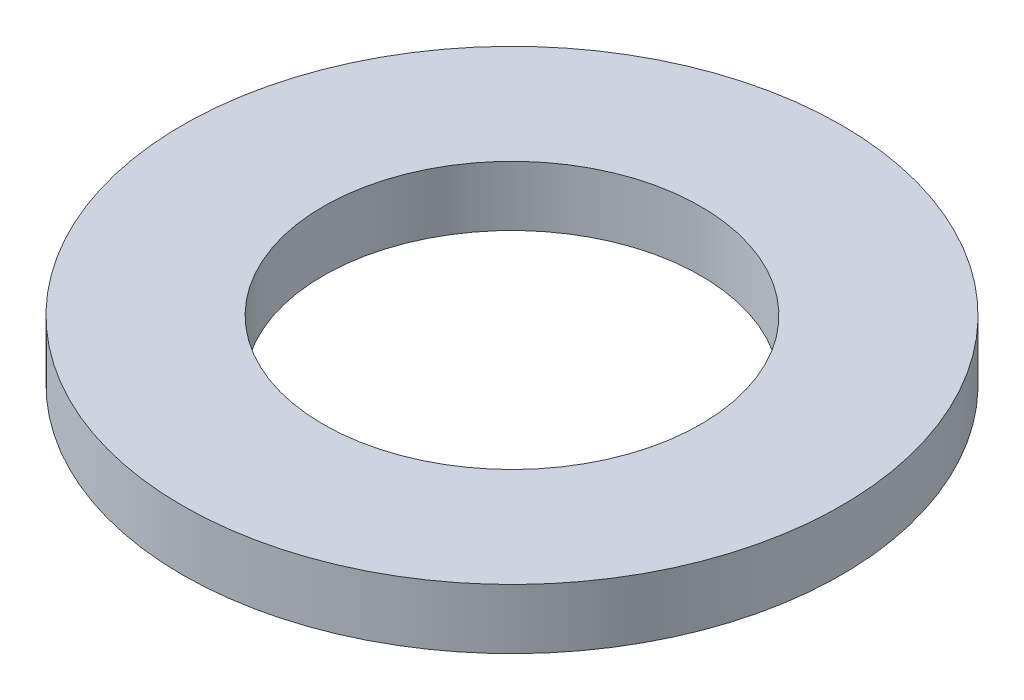
ISO-10303-21;
HEADER;
FILE_DESCRIPTION(('STEP AP214'),'2;1');
FILE_NAME('part.step','',(''),(''),'','','');
FILE_SCHEMA(('AUTOMOTIVE_DESIGN { 1 0 10303 214 1 1 1 1 }'));
ENDSEC;
DATA;
#1=APPLICATION_CONTEXT('core data for automotive mechanical design processes');
#2=APPLICATION_PROTOCOL_DEFINITION('international standard','automotive_design',2000,#1);
#3=PRODUCT_CONTEXT('',#1,'mechanical');
#4=PRODUCT('Part','Part','',(#3));
#5=PRODUCT_RELATED_PRODUCT_CATEGORY('part','',(#4));
#6=PRODUCT_DEFINITION_FORMATION('','',#4);
#7=PRODUCT_DEFINITION_CONTEXT('part definition',#1,'design');
#8=PRODUCT_DEFINITION('design','',#6,#7);
#9=PRODUCT_DEFINITION_SHAPE('','',#8);
#10=(LENGTH_UNIT() NAMED_UNIT(*) SI_UNIT(.MILLI.,.METRE.));
#11=(NAMED_UNIT(*) PLANE_ANGLE_UNIT() SI_UNIT($,.RADIAN.));
#12=(NAMED_UNIT(*) SI_UNIT($,.STERADIAN.) SOLID_ANGLE_UNIT());
#13=UNCERTAINTY_MEASURE_WITH_UNIT(LENGTH_MEASURE(1.E-05),#10,'distance_accuracy_value','');
#14=(GEOMETRIC_REPRESENTATION_CONTEXT(3) GLOBAL_UNCERTAINTY_ASSIGNED_CONTEXT((#13)) GLOBAL_UNIT_ASSIGNED_CONTEXT((#10,
#11,#12)) REPRESENTATION_CONTEXT('',''));
#15=CARTESIAN_POINT('',(0.,0.,0.));
#16=DIRECTION('',(0.,0.,1.));
#17=DIRECTION('',(1.,0.,0.));
#18=AXIS2_PLACEMENT_3D('',#15,#16,#17);
#19=CARTESIAN_POINT('',(0.,1.,0.));
#20=DIRECTION('',(0.,1.,0.));
#21=DIRECTION('',(0.,0.,1.));
#22=AXIS2_PLACEMENT_3D('',#19,#20,#21);
#23=PLANE('',#22);
#24=CARTESIAN_POINT('',(0.,1.,0.));
#25=DIRECTION('',(0.,1.,0.));
#26=DIRECTION('',(0.,0.,1.));
#27=AXIS2_PLACEMENT_3D('',#24,#25,#26);
#28=CIRCLE('',#27,5.5);
#29=CARTESIAN_POINT('',(0.,1.,5.5));
#30=VERTEX_POINT('',#29);
#31=EDGE_CURVE('E10',#30,#30,#28,.T.);
#32=ORIENTED_EDGE('',*,*,#31,.T.);
#33=EDGE_LOOP('',(#32));
#34=FACE_BOUND('',#33,.T.);
#35=CARTESIAN_POINT('',(0.,1.,0.));
#36=DIRECTION('',(0.,1.,0.));
#37=DIRECTION('',(0.,0.,1.));
#38=AXIS2_PLACEMENT_3D('',#35,#36,#37);
#39=CIRCLE('',#38,3.15);
#40=CARTESIAN_POINT('',(0.,1.,3.15));
#41=VERTEX_POINT('',#40);
#42=EDGE_CURVE('E56',#41,#41,#39,.T.);
#43=ORIENTED_EDGE('',*,*,#42,.F.);
#44=EDGE_LOOP('',(#43));
#45=FACE_BOUND('',#44,.T.);
#46=ADVANCED_FACE('F43',(#34,#45),#23,.T.);
#47=CARTESIAN_POINT('',(0.,0.,0.));
#48=DIRECTION('',(0.,1.,0.));
#49=DIRECTION('',(0.,0.,1.));
#50=AXIS2_PLACEMENT_3D('',#47,#48,#49);
#51=PLANE('',#50);
#52=CARTESIAN_POINT('',(0.,0.,0.));
#53=DIRECTION('',(0.,1.,0.));
#54=DIRECTION('',(0.,0.,1.));
#55=AXIS2_PLACEMENT_3D('',#52,#53,#54);
#56=CIRCLE('',#55,5.5);
#57=CARTESIAN_POINT('',(0.,0.,5.5));
#58=VERTEX_POINT('',#57);
#59=EDGE_CURVE('E47',#58,#58,#56,.T.);
#60=ORIENTED_EDGE('',*,*,#59,.F.);
#61=EDGE_LOOP('',(#60));
#62=FACE_BOUND('',#61,.T.);
#63=CARTESIAN_POINT('',(0.,0.,0.));
#64=DIRECTION('',(0.,1.,0.));
#65=DIRECTION('',(0.,0.,1.));
#66=AXIS2_PLACEMENT_3D('',#63,#64,#65);
#67=CIRCLE('',#66,3.15);
#68=CARTESIAN_POINT('',(0.,0.,3.15));
#69=VERTEX_POINT('',#68);
#70=EDGE_CURVE('E58',#69,#69,#67,.T.);
#71=ORIENTED_EDGE('',*,*,#70,.T.);
#72=EDGE_LOOP('',(#71));
#73=FACE_BOUND('',#72,.T.);
#74=ADVANCED_FACE('F70',(#62,#73),#51,.F.);
#75=CARTESIAN_POINT('',(0.,1.,0.));
#76=DIRECTION('',(0.,-1.,0.));
#77=DIRECTION('',(0.,0.,-1.));
#78=AXIS2_PLACEMENT_3D('',#75,#76,#77);
#79=CYLINDRICAL_SURFACE('',#78,5.5);
#80=ORIENTED_EDGE('',*,*,#31,.F.);
#81=EDGE_LOOP('',(#80));
#82=FACE_BOUND('',#81,.T.);
#83=ORIENTED_EDGE('',*,*,#59,.T.);
#84=EDGE_LOOP('',(#83));
#85=FACE_BOUND('',#84,.T.);
#86=ADVANCED_FACE('F45',(#82,#85),#79,.T.);
#87=CARTESIAN_POINT('',(0.,1.,0.));
#88=DIRECTION('',(0.,-1.,0.));
#89=DIRECTION('',(0.,0.,-1.));
#90=AXIS2_PLACEMENT_3D('',#87,#88,#89);
#91=CYLINDRICAL_SURFACE('',#90,3.15);
#92=ORIENTED_EDGE('',*,*,#42,.T.);
#93=EDGE_LOOP('',(#92));
#94=FACE_BOUND('',#93,.T.);
#95=ORIENTED_EDGE('',*,*,#70,.F.);
#96=EDGE_LOOP('',(#95));
#97=FACE_BOUND('',#96,.T.);
#98=ADVANCED_FACE('F66',(#94,#97),#91,.F.);
#99=CLOSED_SHELL('',(#46,#74,#86,#98));
#100=MANIFOLD_SOLID_BREP('B2',#99);
#101=ADVANCED_BREP_SHAPE_REPRESENTATION('',(#18,#100),#14);
#102=SHAPE_DEFINITION_REPRESENTATION(#9,#101);
ENDSEC;
END-ISO-10303-21;
